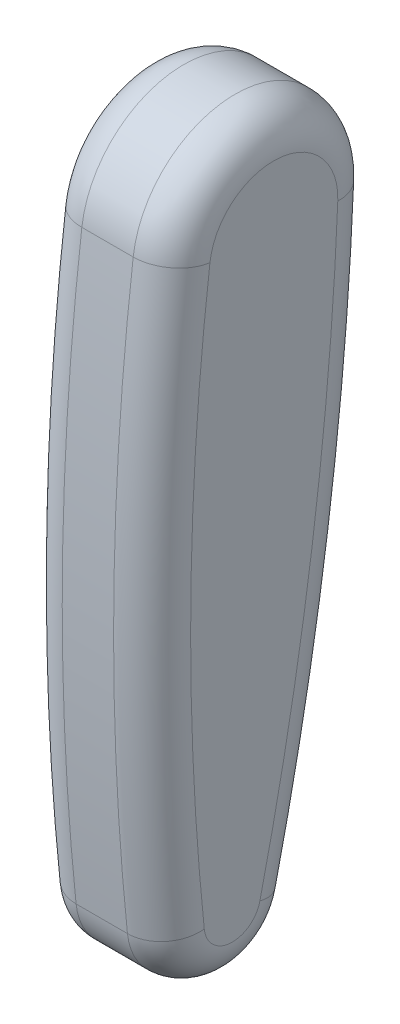
ISO-10303-21;
HEADER;
FILE_DESCRIPTION(('STEP AP214'),'2;1');
FILE_NAME('part.step','',(''),(''),'','','');
FILE_SCHEMA(('AUTOMOTIVE_DESIGN { 1 0 10303 214 1 1 1 1 }'));
ENDSEC;
DATA;
#1=APPLICATION_CONTEXT('core data for automotive mechanical design processes');
#2=APPLICATION_PROTOCOL_DEFINITION('international standard','automotive_design',2000,#1);
#3=PRODUCT_CONTEXT('',#1,'mechanical');
#4=PRODUCT('Part','Part','',(#3));
#5=PRODUCT_RELATED_PRODUCT_CATEGORY('part','',(#4));
#6=PRODUCT_DEFINITION_FORMATION('','',#4);
#7=PRODUCT_DEFINITION_CONTEXT('part definition',#1,'design');
#8=PRODUCT_DEFINITION('design','',#6,#7);
#9=PRODUCT_DEFINITION_SHAPE('','',#8);
#10=(LENGTH_UNIT() NAMED_UNIT(*) SI_UNIT(.MILLI.,.METRE.));
#11=(NAMED_UNIT(*) PLANE_ANGLE_UNIT() SI_UNIT($,.RADIAN.));
#12=(NAMED_UNIT(*) SI_UNIT($,.STERADIAN.) SOLID_ANGLE_UNIT());
#13=UNCERTAINTY_MEASURE_WITH_UNIT(LENGTH_MEASURE(1.E-05),#10,'distance_accuracy_value','');
#14=(GEOMETRIC_REPRESENTATION_CONTEXT(3) GLOBAL_UNCERTAINTY_ASSIGNED_CONTEXT((#13)) GLOBAL_UNIT_ASSIGNED_CONTEXT((#10,
#11,#12)) REPRESENTATION_CONTEXT('',''));
#15=CARTESIAN_POINT('',(0.,0.,0.));
#16=DIRECTION('',(0.,0.,1.));
#17=DIRECTION('',(1.,0.,0.));
#18=AXIS2_PLACEMENT_3D('',#15,#16,#17);
#19=CARTESIAN_POINT('',(222.25,-234.840307231112,-1250.38847130733));
#20=DIRECTION('',(1.,0.,0.));
#21=DIRECTION('',(0.,0.,-1.));
#22=AXIS2_PLACEMENT_3D('',#19,#20,#21);
#23=CYLINDRICAL_SURFACE('',#22,1270.);
#24=DIRECTION('',(1.,0.,0.));
#25=VECTOR('',#24,1.);
#26=CARTESIAN_POINT('',(222.25,-366.573375726702,12.7609255039649));
#27=LINE('',#26,#25);
#28=CARTESIAN_POINT('',(241.3,-366.573375726702,12.7609255039649));
#29=VERTEX_POINT('',#28);
#30=CARTESIAN_POINT('',(266.7,-366.573375726702,12.7609255039649));
#31=VERTEX_POINT('',#30);
#32=EDGE_CURVE('E144',#29,#31,#27,.T.);
#33=ORIENTED_EDGE('',*,*,#32,.T.);
#34=CARTESIAN_POINT('',(266.7,-234.840307231112,-1250.38847130733));
#35=DIRECTION('',(-1.,0.,0.));
#36=DIRECTION('',(0.,0.,1.));
#37=AXIS2_PLACEMENT_3D('',#34,#35,#36);
#38=CIRCLE('',#37,1270.);
#39=CARTESIAN_POINT('',(266.7,-78.2306079922428,9.91839692132181));
#40=VERTEX_POINT('',#39);
#41=EDGE_CURVE('E153',#31,#40,#38,.T.);
#42=ORIENTED_EDGE('',*,*,#41,.T.);
#43=DIRECTION('',(1.,0.,0.));
#44=VECTOR('',#43,1.);
#45=CARTESIAN_POINT('',(222.25,-78.2306079922428,9.91839692132181));
#46=LINE('',#45,#44);
#47=CARTESIAN_POINT('',(241.3,-78.2306079922428,9.91839692132181));
#48=VERTEX_POINT('',#47);
#49=EDGE_CURVE('E122',#48,#40,#46,.T.);
#50=ORIENTED_EDGE('',*,*,#49,.F.);
#51=CARTESIAN_POINT('',(241.3,-234.840307231112,-1250.38847130733));
#52=DIRECTION('',(-1.,0.,0.));
#53=DIRECTION('',(0.,0.,1.));
#54=AXIS2_PLACEMENT_3D('',#51,#52,#53);
#55=CIRCLE('',#54,1270.);
#56=EDGE_CURVE('E155',#48,#29,#55,.F.);
#57=ORIENTED_EDGE('',*,*,#56,.T.);
#58=EDGE_LOOP('',(#33,#42,#50,#57));
#59=FACE_BOUND('',#58,.T.);
#60=ADVANCED_FACE('F35',(#59),#23,.T.);
#61=CARTESIAN_POINT('',(222.25,-84.4949959617975,-40.4938778078239));
#62=DIRECTION('',(1.,0.,0.));
#63=DIRECTION('',(0.,0.,-1.));
#64=AXIS2_PLACEMENT_3D('',#61,#62,#63);
#65=CYLINDRICAL_SURFACE('',#64,50.7999999999996);
#66=ORIENTED_EDGE('',*,*,#49,.T.);
#67=CARTESIAN_POINT('',(266.7,-84.4949959617975,-40.4938778078239));
#68=DIRECTION('',(-1.,0.,0.));
#69=DIRECTION('',(0.,0.,1.));
#70=AXIS2_PLACEMENT_3D('',#67,#68,#69);
#71=CIRCLE('',#70,50.7999999999996);
#72=CARTESIAN_POINT('',(266.7,-86.6438502438308,-91.2484088890442));
#73=VERTEX_POINT('',#72);
#74=EDGE_CURVE('E121',#40,#73,#71,.T.);
#75=ORIENTED_EDGE('',*,*,#74,.T.);
#76=DIRECTION('',(1.,0.,0.));
#77=VECTOR('',#76,1.);
#78=CARTESIAN_POINT('',(222.25,-86.6438502438308,-91.2484088890442));
#79=LINE('',#78,#77);
#80=CARTESIAN_POINT('',(241.3,-86.6438502438308,-91.2484088890442));
#81=VERTEX_POINT('',#80);
#82=EDGE_CURVE('E104',#81,#73,#79,.T.);
#83=ORIENTED_EDGE('',*,*,#82,.F.);
#84=CARTESIAN_POINT('',(241.3,-84.4949959617975,-40.4938778078239));
#85=DIRECTION('',(-1.,0.,0.));
#86=DIRECTION('',(0.,0.,1.));
#87=AXIS2_PLACEMENT_3D('',#84,#85,#86);
#88=CIRCLE('',#87,50.7999999999996);
#89=EDGE_CURVE('E118',#81,#48,#88,.F.);
#90=ORIENTED_EDGE('',*,*,#89,.T.);
#91=EDGE_LOOP('',(#66,#75,#83,#90));
#92=FACE_BOUND('',#91,.T.);
#93=ADVANCED_FACE('F117',(#92),#65,.T.);
#94=CARTESIAN_POINT('',(222.25,-22.1782217828215,1431.38752354757));
#95=DIRECTION('',(1.,0.,0.));
#96=DIRECTION('',(0.,0.,-1.));
#97=AXIS2_PLACEMENT_3D('',#94,#95,#96);
#98=CYLINDRICAL_SURFACE('',#97,1524.);
#99=ORIENTED_EDGE('',*,*,#82,.T.);
#100=CARTESIAN_POINT('',(266.7,-22.1782217828215,1431.38752354757));
#101=DIRECTION('',(-1.,0.,0.));
#102=DIRECTION('',(0.,0.,1.));
#103=AXIS2_PLACEMENT_3D('',#100,#101,#102);
#104=CIRCLE('',#103,1524.);
#105=CARTESIAN_POINT('',(266.7,-370.699612750108,-52.2259166848305));
#106=VERTEX_POINT('',#105);
#107=EDGE_CURVE('E110',#73,#106,#104,.T.);
#108=ORIENTED_EDGE('',*,*,#107,.T.);
#109=DIRECTION('',(1.,0.,0.));
#110=VECTOR('',#109,1.);
#111=CARTESIAN_POINT('',(222.25,-370.699612750108,-52.2259166848305));
#112=LINE('',#111,#110);
#113=CARTESIAN_POINT('',(241.3,-370.699612750108,-52.2259166848305));
#114=VERTEX_POINT('',#113);
#115=EDGE_CURVE('E106',#114,#106,#112,.T.);
#116=ORIENTED_EDGE('',*,*,#115,.F.);
#117=CARTESIAN_POINT('',(241.3,-22.1782217828215,1431.38752354757));
#118=DIRECTION('',(-1.,0.,0.));
#119=DIRECTION('',(0.,0.,1.));
#120=AXIS2_PLACEMENT_3D('',#117,#118,#119);
#121=CIRCLE('',#120,1524.);
#122=EDGE_CURVE('E101',#114,#81,#121,.F.);
#123=ORIENTED_EDGE('',*,*,#122,.T.);
#124=EDGE_LOOP('',(#99,#108,#116,#123));
#125=FACE_BOUND('',#124,.T.);
#126=ADVANCED_FACE('F103',(#125),#98,.T.);
#127=CARTESIAN_POINT('',(222.25,-363.148315945816,-20.0809588131286));
#128=DIRECTION('',(1.,0.,0.));
#129=DIRECTION('',(0.,0.,-1.));
#130=AXIS2_PLACEMENT_3D('',#127,#128,#129);
#131=CYLINDRICAL_SURFACE('',#130,33.0199999999998);
#132=ORIENTED_EDGE('',*,*,#115,.T.);
#133=CARTESIAN_POINT('',(266.7,-363.148315945816,-20.0809588131286));
#134=DIRECTION('',(-1.,0.,0.));
#135=DIRECTION('',(0.,0.,1.));
#136=AXIS2_PLACEMENT_3D('',#133,#134,#135);
#137=CIRCLE('',#136,33.0199999999998);
#138=EDGE_CURVE('E157',#106,#31,#137,.T.);
#139=ORIENTED_EDGE('',*,*,#138,.T.);
#140=ORIENTED_EDGE('',*,*,#32,.F.);
#141=CARTESIAN_POINT('',(241.3,-363.148315945816,-20.0809588131286));
#142=DIRECTION('',(-1.,0.,0.));
#143=DIRECTION('',(0.,0.,1.));
#144=AXIS2_PLACEMENT_3D('',#141,#142,#143);
#145=CIRCLE('',#144,33.0199999999998);
#146=EDGE_CURVE('E159',#29,#114,#145,.F.);
#147=ORIENTED_EDGE('',*,*,#146,.T.);
#148=EDGE_LOOP('',(#132,#139,#140,#147));
#149=FACE_BOUND('',#148,.T.);
#150=ADVANCED_FACE('F197',(#149),#131,.T.);
#151=CARTESIAN_POINT('',(222.25,-159.667651596455,-645.441174557577));
#152=DIRECTION('',(-1.,0.,0.));
#153=DIRECTION('',(0.,0.,1.));
#154=AXIS2_PLACEMENT_3D('',#151,#152,#153);
#155=PLANE('',#154);
#156=CARTESIAN_POINT('',(222.25,-22.1782217828215,1431.38752354757));
#157=DIRECTION('',(-1.,0.,0.));
#158=DIRECTION('',(0.,0.,1.));
#159=AXIS2_PLACEMENT_3D('',#156,#157,#158);
#160=CIRCLE('',#159,1504.95);
#161=CARTESIAN_POINT('',(222.25,-85.8380298880682,-72.2154597335864));
#162=VERTEX_POINT('',#161);
#163=CARTESIAN_POINT('',(222.25,-366.343095363017,-33.6807486819255));
#164=VERTEX_POINT('',#163);
#165=EDGE_CURVE('E44',#162,#164,#160,.T.);
#166=ORIENTED_EDGE('',*,*,#165,.T.);
#167=CARTESIAN_POINT('',(222.25,-363.148315945816,-20.0809588131286));
#168=DIRECTION('',(-1.,0.,0.));
#169=DIRECTION('',(0.,0.,1.));
#170=AXIS2_PLACEMENT_3D('',#167,#168,#169);
#171=CIRCLE('',#170,13.9699999999998);
#172=CARTESIAN_POINT('',(222.25,-364.597379699268,-6.18631544820497));
#173=VERTEX_POINT('',#172);
#174=EDGE_CURVE('E11',#164,#173,#171,.T.);
#175=ORIENTED_EDGE('',*,*,#174,.T.);
#176=CARTESIAN_POINT('',(222.25,-234.840307231112,-1250.38847130733));
#177=DIRECTION('',(-1.,0.,0.));
#178=DIRECTION('',(0.,0.,1.));
#179=AXIS2_PLACEMENT_3D('',#176,#177,#178);
#180=CIRCLE('',#179,1250.95);
#181=CARTESIAN_POINT('',(222.25,-80.5797534808259,-8.98620610210817));
#182=VERTEX_POINT('',#181);
#183=EDGE_CURVE('E151',#173,#182,#180,.T.);
#184=ORIENTED_EDGE('',*,*,#183,.T.);
#185=CARTESIAN_POINT('',(222.25,-84.4949959617975,-40.4938778078239));
#186=DIRECTION('',(-1.,0.,0.));
#187=DIRECTION('',(0.,0.,1.));
#188=AXIS2_PLACEMENT_3D('',#185,#186,#187);
#189=CIRCLE('',#188,31.7499999999996);
#190=EDGE_CURVE('E55',#182,#162,#189,.T.);
#191=ORIENTED_EDGE('',*,*,#190,.T.);
#192=EDGE_LOOP('',(#166,#175,#184,#191));
#193=FACE_BOUND('',#192,.T.);
#194=ADVANCED_FACE('F203',(#193),#155,.T.);
#195=CARTESIAN_POINT('',(285.75,-159.667651596455,-645.441174557577));
#196=DIRECTION('',(-1.,0.,0.));
#197=DIRECTION('',(0.,0.,1.));
#198=AXIS2_PLACEMENT_3D('',#195,#196,#197);
#199=PLANE('',#198);
#200=CARTESIAN_POINT('',(285.75,-22.1782217828215,1431.38752354757));
#201=DIRECTION('',(-1.,0.,0.));
#202=DIRECTION('',(0.,0.,1.));
#203=AXIS2_PLACEMENT_3D('',#200,#201,#202);
#204=CIRCLE('',#203,1504.95);
#205=CARTESIAN_POINT('',(285.75,-366.343095363016,-33.6807486819255));
#206=VERTEX_POINT('',#205);
#207=CARTESIAN_POINT('',(285.75,-85.8380298880683,-72.2154597335864));
#208=VERTEX_POINT('',#207);
#209=EDGE_CURVE('E164',#206,#208,#204,.F.);
#210=ORIENTED_EDGE('',*,*,#209,.T.);
#211=CARTESIAN_POINT('',(285.75,-84.4949959617975,-40.4938778078239));
#212=DIRECTION('',(-1.,0.,0.));
#213=DIRECTION('',(0.,0.,1.));
#214=AXIS2_PLACEMENT_3D('',#211,#212,#213);
#215=CIRCLE('',#214,31.7499999999996);
#216=CARTESIAN_POINT('',(285.75,-80.5797534808259,-8.98620610210817));
#217=VERTEX_POINT('',#216);
#218=EDGE_CURVE('E111',#208,#217,#215,.F.);
#219=ORIENTED_EDGE('',*,*,#218,.T.);
#220=CARTESIAN_POINT('',(285.75,-234.840307231112,-1250.38847130733));
#221=DIRECTION('',(-1.,0.,0.));
#222=DIRECTION('',(0.,0.,1.));
#223=AXIS2_PLACEMENT_3D('',#220,#221,#222);
#224=CIRCLE('',#223,1250.95);
#225=CARTESIAN_POINT('',(285.75,-364.597379699268,-6.18631544820497));
#226=VERTEX_POINT('',#225);
#227=EDGE_CURVE('E168',#217,#226,#224,.F.);
#228=ORIENTED_EDGE('',*,*,#227,.T.);
#229=CARTESIAN_POINT('',(285.75,-363.148315945816,-20.0809588131286));
#230=DIRECTION('',(-1.,0.,0.));
#231=DIRECTION('',(0.,0.,1.));
#232=AXIS2_PLACEMENT_3D('',#229,#230,#231);
#233=CIRCLE('',#232,13.9699999999998);
#234=EDGE_CURVE('E166',#226,#206,#233,.F.);
#235=ORIENTED_EDGE('',*,*,#234,.T.);
#236=EDGE_LOOP('',(#210,#219,#228,#235));
#237=FACE_BOUND('',#236,.T.);
#238=ADVANCED_FACE('F205',(#237),#199,.F.);
#239=CARTESIAN_POINT('',(266.7,-363.148315945816,-20.0809588131286));
#240=DIRECTION('',(-1.,0.,0.));
#241=DIRECTION('',(0.,0.,1.));
#242=AXIS2_PLACEMENT_3D('',#239,#240,#241);
#243=DEGENERATE_TOROIDAL_SURFACE('',#242,13.9699999999998,19.05,.T.);
#244=CARTESIAN_POINT('',(266.7,-366.343095363016,-33.6807486819255));
#245=DIRECTION('',(0.,0.973499632698427,-0.228688576750188));
#246=DIRECTION('',(0.,0.228688576750188,0.973499632698428));
#247=AXIS2_PLACEMENT_3D('',#244,#245,#246);
#248=CIRCLE('',#247,19.05);
#249=EDGE_CURVE('E145',#206,#106,#248,.T.);
#250=ORIENTED_EDGE('',*,*,#249,.F.);
#251=ORIENTED_EDGE('',*,*,#234,.F.);
#252=CARTESIAN_POINT('',(266.7,-364.597379699268,-6.18631544820453));
#253=DIRECTION('',(0.,0.994605824260862,0.103726825587077));
#254=DIRECTION('',(0.,-0.103726825587077,0.994605824260862));
#255=AXIS2_PLACEMENT_3D('',#252,#253,#254);
#256=CIRCLE('',#255,19.05);
#257=EDGE_CURVE('E141',#31,#226,#256,.T.);
#258=ORIENTED_EDGE('',*,*,#257,.F.);
#259=ORIENTED_EDGE('',*,*,#138,.F.);
#260=EDGE_LOOP('',(#250,#251,#258,#259));
#261=FACE_BOUND('',#260,.T.);
#262=ADVANCED_FACE('F184',(#261),#243,.T.);
#263=CARTESIAN_POINT('',(266.7,-234.840307231112,-1250.38847130733));
#264=DIRECTION('',(-1.,0.,0.));
#265=DIRECTION('',(0.,0.,1.));
#266=AXIS2_PLACEMENT_3D('',#263,#264,#265);
#267=TOROIDAL_SURFACE('',#266,1250.95,19.05);
#268=ORIENTED_EDGE('',*,*,#257,.T.);
#269=ORIENTED_EDGE('',*,*,#227,.F.);
#270=CARTESIAN_POINT('',(266.7,-80.5797534808258,-8.98620610210796));
#271=DIRECTION('',(0.,0.992367612778466,-0.123314723810134));
#272=DIRECTION('',(0.,0.123314723810134,0.992367612778466));
#273=AXIS2_PLACEMENT_3D('',#270,#271,#272);
#274=CIRCLE('',#273,19.05);
#275=EDGE_CURVE('E132',#40,#217,#274,.T.);
#276=ORIENTED_EDGE('',*,*,#275,.F.);
#277=ORIENTED_EDGE('',*,*,#41,.F.);
#278=EDGE_LOOP('',(#268,#269,#276,#277));
#279=FACE_BOUND('',#278,.T.);
#280=ADVANCED_FACE('F188',(#279),#267,.T.);
#281=CARTESIAN_POINT('',(266.7,-22.1782217828215,1431.38752354757));
#282=DIRECTION('',(-1.,0.,0.));
#283=DIRECTION('',(0.,0.,1.));
#284=AXIS2_PLACEMENT_3D('',#281,#282,#283);
#285=TOROIDAL_SURFACE('',#284,1504.95,19.05);
#286=ORIENTED_EDGE('',*,*,#249,.T.);
#287=ORIENTED_EDGE('',*,*,#107,.F.);
#288=CARTESIAN_POINT('',(266.7,-85.8380298880683,-72.2154597335864));
#289=DIRECTION('',(0.,0.999104942543712,-0.0423002811423871));
#290=DIRECTION('',(0.,0.0423002811423871,0.999104942543713));
#291=AXIS2_PLACEMENT_3D('',#288,#289,#290);
#292=CIRCLE('',#291,19.05);
#293=EDGE_CURVE('E131',#208,#73,#292,.T.);
#294=ORIENTED_EDGE('',*,*,#293,.F.);
#295=ORIENTED_EDGE('',*,*,#209,.F.);
#296=EDGE_LOOP('',(#286,#287,#294,#295));
#297=FACE_BOUND('',#296,.T.);
#298=ADVANCED_FACE('F196',(#297),#285,.T.);
#299=CARTESIAN_POINT('',(266.7,-84.4949959617975,-40.4938778078239));
#300=DIRECTION('',(-1.,0.,0.));
#301=DIRECTION('',(0.,0.,1.));
#302=AXIS2_PLACEMENT_3D('',#299,#300,#301);
#303=TOROIDAL_SURFACE('',#302,31.7499999999996,19.05);
#304=ORIENTED_EDGE('',*,*,#275,.T.);
#305=ORIENTED_EDGE('',*,*,#218,.F.);
#306=ORIENTED_EDGE('',*,*,#293,.T.);
#307=ORIENTED_EDGE('',*,*,#74,.F.);
#308=EDGE_LOOP('',(#304,#305,#306,#307));
#309=FACE_BOUND('',#308,.T.);
#310=ADVANCED_FACE('F191',(#309),#303,.T.);
#311=CARTESIAN_POINT('',(241.3,-84.4949959617975,-40.4938778078239));
#312=DIRECTION('',(-1.,0.,0.));
#313=DIRECTION('',(0.,0.,1.));
#314=AXIS2_PLACEMENT_3D('',#311,#312,#313);
#315=TOROIDAL_SURFACE('',#314,31.7499999999996,19.05);
#316=CARTESIAN_POINT('',(241.3,-80.5797534808258,-8.98620610210796));
#317=DIRECTION('',(0.,-0.992367612778466,0.123314723810133));
#318=DIRECTION('',(0.,-0.123314723810133,-0.992367612778466));
#319=AXIS2_PLACEMENT_3D('',#316,#317,#318);
#320=CIRCLE('',#319,19.05);
#321=EDGE_CURVE('E127',#48,#182,#320,.T.);
#322=ORIENTED_EDGE('',*,*,#321,.F.);
#323=ORIENTED_EDGE('',*,*,#89,.F.);
#324=CARTESIAN_POINT('',(241.3,-85.8380298880682,-72.2154597335864));
#325=DIRECTION('',(0.,-0.999104942543712,0.0423002811423944));
#326=DIRECTION('',(0.,-0.0423002811423944,-0.999104942543712));
#327=AXIS2_PLACEMENT_3D('',#324,#325,#326);
#328=CIRCLE('',#327,19.05);
#329=EDGE_CURVE('E39',#162,#81,#328,.T.);
#330=ORIENTED_EDGE('',*,*,#329,.F.);
#331=ORIENTED_EDGE('',*,*,#190,.F.);
#332=EDGE_LOOP('',(#322,#323,#330,#331));
#333=FACE_BOUND('',#332,.T.);
#334=ADVANCED_FACE('F37',(#333),#315,.T.);
#335=CARTESIAN_POINT('',(241.3,-22.1782217828215,1431.38752354757));
#336=DIRECTION('',(-1.,0.,0.));
#337=DIRECTION('',(0.,0.,1.));
#338=AXIS2_PLACEMENT_3D('',#335,#336,#337);
#339=TOROIDAL_SURFACE('',#338,1504.95,19.05);
#340=ORIENTED_EDGE('',*,*,#329,.T.);
#341=ORIENTED_EDGE('',*,*,#122,.F.);
#342=CARTESIAN_POINT('',(241.3,-366.343095363017,-33.6807486819255));
#343=DIRECTION('',(0.,-0.973499632698428,0.228688576750185));
#344=DIRECTION('',(0.,-0.228688576750185,-0.973499632698428));
#345=AXIS2_PLACEMENT_3D('',#342,#343,#344);
#346=CIRCLE('',#345,19.05);
#347=EDGE_CURVE('E134',#164,#114,#346,.T.);
#348=ORIENTED_EDGE('',*,*,#347,.F.);
#349=ORIENTED_EDGE('',*,*,#165,.F.);
#350=EDGE_LOOP('',(#340,#341,#348,#349));
#351=FACE_BOUND('',#350,.T.);
#352=ADVANCED_FACE('F130',(#351),#339,.T.);
#353=CARTESIAN_POINT('',(241.3,-234.840307231112,-1250.38847130733));
#354=DIRECTION('',(-1.,0.,0.));
#355=DIRECTION('',(0.,0.,1.));
#356=AXIS2_PLACEMENT_3D('',#353,#354,#355);
#357=TOROIDAL_SURFACE('',#356,1250.95,19.05);
#358=ORIENTED_EDGE('',*,*,#321,.T.);
#359=ORIENTED_EDGE('',*,*,#183,.F.);
#360=CARTESIAN_POINT('',(241.3,-364.597379699268,-6.18631544820475));
#361=DIRECTION('',(0.,-0.994605824260862,-0.103726825587077));
#362=DIRECTION('',(0.,0.103726825587077,-0.994605824260862));
#363=AXIS2_PLACEMENT_3D('',#360,#361,#362);
#364=CIRCLE('',#363,19.05);
#365=EDGE_CURVE('E137',#29,#173,#364,.T.);
#366=ORIENTED_EDGE('',*,*,#365,.F.);
#367=ORIENTED_EDGE('',*,*,#56,.F.);
#368=EDGE_LOOP('',(#358,#359,#366,#367));
#369=FACE_BOUND('',#368,.T.);
#370=ADVANCED_FACE('F202',(#369),#357,.T.);
#371=CARTESIAN_POINT('',(241.3,-363.148315945816,-20.0809588131286));
#372=DIRECTION('',(-1.,0.,0.));
#373=DIRECTION('',(0.,0.,1.));
#374=AXIS2_PLACEMENT_3D('',#371,#372,#373);
#375=DEGENERATE_TOROIDAL_SURFACE('',#374,13.9699999999998,19.05,.T.);
#376=ORIENTED_EDGE('',*,*,#347,.T.);
#377=ORIENTED_EDGE('',*,*,#146,.F.);
#378=ORIENTED_EDGE('',*,*,#365,.T.);
#379=ORIENTED_EDGE('',*,*,#174,.F.);
#380=EDGE_LOOP('',(#376,#377,#378,#379));
#381=FACE_BOUND('',#380,.T.);
#382=ADVANCED_FACE('F200',(#381),#375,.T.);
#383=CLOSED_SHELL('',(#60,#93,#126,#150,#194,#238,#262,#280,#298,#310,#334,#352,#370,#382));
#384=MANIFOLD_SOLID_BREP('B2',#383);
#385=ADVANCED_BREP_SHAPE_REPRESENTATION('',(#18,#384),#14);
#386=SHAPE_DEFINITION_REPRESENTATION(#9,#385);
ENDSEC;
END-ISO-10303-21;
